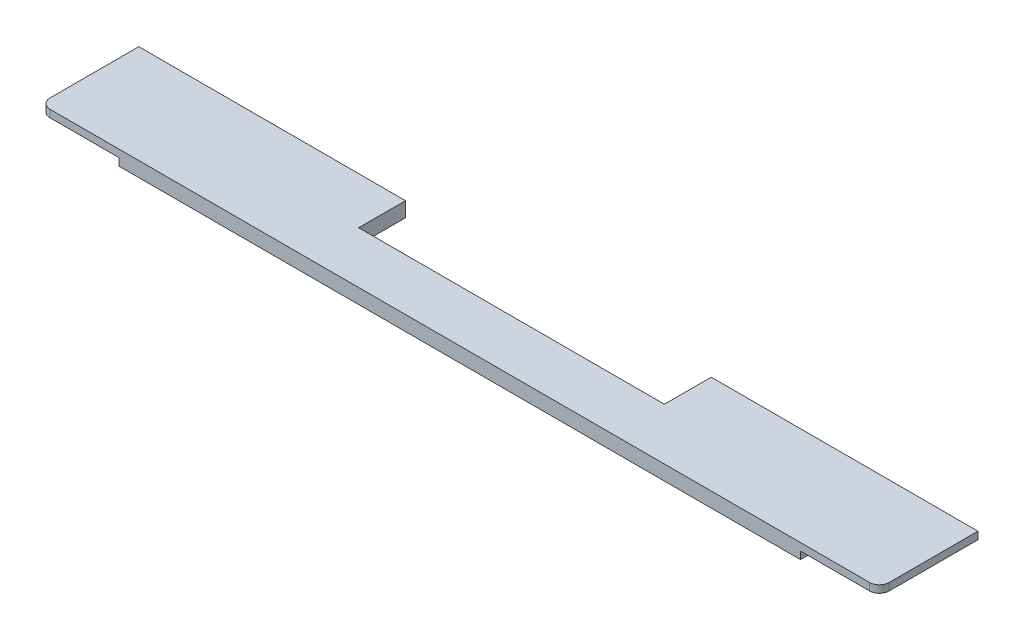
ISO-10303-21;
HEADER;
FILE_DESCRIPTION(('STEP AP214'),'2;1');
FILE_NAME('part.step','',(''),(''),'','','');
FILE_SCHEMA(('AUTOMOTIVE_DESIGN { 1 0 10303 214 1 1 1 1 }'));
ENDSEC;
DATA;
#1=APPLICATION_CONTEXT('core data for automotive mechanical design processes');
#2=APPLICATION_PROTOCOL_DEFINITION('international standard','automotive_design',2000,#1);
#3=PRODUCT_CONTEXT('',#1,'mechanical');
#4=PRODUCT('Part','Part','',(#3));
#5=PRODUCT_RELATED_PRODUCT_CATEGORY('part','',(#4));
#6=PRODUCT_DEFINITION_FORMATION('','',#4);
#7=PRODUCT_DEFINITION_CONTEXT('part definition',#1,'design');
#8=PRODUCT_DEFINITION('design','',#6,#7);
#9=PRODUCT_DEFINITION_SHAPE('','',#8);
#10=(LENGTH_UNIT() NAMED_UNIT(*) SI_UNIT(.MILLI.,.METRE.));
#11=(NAMED_UNIT(*) PLANE_ANGLE_UNIT() SI_UNIT($,.RADIAN.));
#12=(NAMED_UNIT(*) SI_UNIT($,.STERADIAN.) SOLID_ANGLE_UNIT());
#13=UNCERTAINTY_MEASURE_WITH_UNIT(LENGTH_MEASURE(1.E-05),#10,'distance_accuracy_value','');
#14=(GEOMETRIC_REPRESENTATION_CONTEXT(3) GLOBAL_UNCERTAINTY_ASSIGNED_CONTEXT((#13)) GLOBAL_UNIT_ASSIGNED_CONTEXT((#10,
#11,#12)) REPRESENTATION_CONTEXT('',''));
#15=CARTESIAN_POINT('',(0.,0.,0.));
#16=DIRECTION('',(0.,0.,1.));
#17=DIRECTION('',(1.,0.,0.));
#18=AXIS2_PLACEMENT_3D('',#15,#16,#17);
#19=CARTESIAN_POINT('',(0.,3.,-20.));
#20=DIRECTION('',(0.,0.,1.));
#21=DIRECTION('',(1.,0.,0.));
#22=AXIS2_PLACEMENT_3D('',#19,#20,#21);
#23=PLANE('',#22);
#24=DIRECTION('',(-1.,0.,0.));
#25=VECTOR('',#24,1.);
#26=CARTESIAN_POINT('',(0.,3.,-20.));
#27=LINE('',#26,#25);
#28=CARTESIAN_POINT('',(38.1,3.,-20.));
#29=VERTEX_POINT('',#28);
#30=CARTESIAN_POINT('',(-16.,3.,-20.));
#31=VERTEX_POINT('',#30);
#32=EDGE_CURVE('E146',#29,#31,#27,.T.);
#33=ORIENTED_EDGE('',*,*,#32,.F.);
#34=DIRECTION('',(0.,1.,0.));
#35=VECTOR('',#34,1.);
#36=CARTESIAN_POINT('',(38.1,0.,-20.));
#37=LINE('',#36,#35);
#38=CARTESIAN_POINT('',(38.1,0.,-20.));
#39=VERTEX_POINT('',#38);
#40=EDGE_CURVE('E232',#39,#29,#37,.T.);
#41=ORIENTED_EDGE('',*,*,#40,.F.);
#42=DIRECTION('',(-1.,0.,0.));
#43=VECTOR('',#42,1.);
#44=CARTESIAN_POINT('',(0.,0.,-20.));
#45=LINE('',#44,#43);
#46=CARTESIAN_POINT('',(0.,0.,-20.));
#47=VERTEX_POINT('',#46);
#48=EDGE_CURVE('E263',#39,#47,#45,.T.);
#49=ORIENTED_EDGE('',*,*,#48,.T.);
#50=DIRECTION('',(0.,-1.,0.));
#51=VECTOR('',#50,1.);
#52=CARTESIAN_POINT('',(0.,3.,-20.));
#53=LINE('',#52,#51);
#54=CARTESIAN_POINT('',(0.,1.5,-20.));
#55=VERTEX_POINT('',#54);
#56=EDGE_CURVE('E251',#55,#47,#53,.T.);
#57=ORIENTED_EDGE('',*,*,#56,.F.);
#58=DIRECTION('',(-1.,0.,0.));
#59=VECTOR('',#58,1.);
#60=CARTESIAN_POINT('',(0.,1.5,-20.));
#61=LINE('',#60,#59);
#62=CARTESIAN_POINT('',(-16.,1.5,-20.));
#63=VERTEX_POINT('',#62);
#64=EDGE_CURVE('E163',#55,#63,#61,.T.);
#65=ORIENTED_EDGE('',*,*,#64,.T.);
#66=DIRECTION('',(0.,1.,0.));
#67=VECTOR('',#66,1.);
#68=CARTESIAN_POINT('',(-16.,1.5,-20.));
#69=LINE('',#68,#67);
#70=EDGE_CURVE('E161',#63,#31,#69,.T.);
#71=ORIENTED_EDGE('',*,*,#70,.T.);
#72=EDGE_LOOP('',(#33,#41,#49,#57,#65,#71));
#73=FACE_BOUND('',#72,.T.);
#74=ADVANCED_FACE('F43',(#73),#23,.F.);
#75=CARTESIAN_POINT('',(0.,3.,0.));
#76=DIRECTION('',(1.,0.,0.));
#77=DIRECTION('',(0.,0.,-1.));
#78=AXIS2_PLACEMENT_3D('',#75,#76,#77);
#79=PLANE('',#78);
#80=DIRECTION('',(0.,-1.,0.));
#81=VECTOR('',#80,1.);
#82=CARTESIAN_POINT('',(0.,3.,0.));
#83=LINE('',#82,#81);
#84=CARTESIAN_POINT('',(0.,1.5,0.));
#85=VERTEX_POINT('',#84);
#86=CARTESIAN_POINT('',(0.,0.,0.));
#87=VERTEX_POINT('',#86);
#88=EDGE_CURVE('E275',#85,#87,#83,.T.);
#89=ORIENTED_EDGE('',*,*,#88,.F.);
#90=DIRECTION('',(0.,0.,-1.));
#91=VECTOR('',#90,1.);
#92=CARTESIAN_POINT('',(0.,1.5,-20.));
#93=LINE('',#92,#91);
#94=EDGE_CURVE('E176',#85,#55,#93,.T.);
#95=ORIENTED_EDGE('',*,*,#94,.T.);
#96=ORIENTED_EDGE('',*,*,#56,.T.);
#97=DIRECTION('',(0.,0.,1.));
#98=VECTOR('',#97,1.);
#99=CARTESIAN_POINT('',(0.,0.,0.));
#100=LINE('',#99,#98);
#101=EDGE_CURVE('E235',#47,#87,#100,.T.);
#102=ORIENTED_EDGE('',*,*,#101,.T.);
#103=EDGE_LOOP('',(#89,#95,#96,#102));
#104=FACE_BOUND('',#103,.T.);
#105=ADVANCED_FACE('F305',(#104),#79,.F.);
#106=CARTESIAN_POINT('',(0.,3.,0.));
#107=DIRECTION('',(0.,0.,-1.));
#108=DIRECTION('',(-1.,0.,0.));
#109=AXIS2_PLACEMENT_3D('',#106,#107,#108);
#110=PLANE('',#109);
#111=DIRECTION('',(1.,0.,0.));
#112=VECTOR('',#111,1.);
#113=CARTESIAN_POINT('',(0.,3.,0.));
#114=LINE('',#113,#112);
#115=CARTESIAN_POINT('',(-14.,3.,0.));
#116=VERTEX_POINT('',#115);
#117=CARTESIAN_POINT('',(152.2,3.,0.));
#118=VERTEX_POINT('',#117);
#119=EDGE_CURVE('E158',#116,#118,#114,.T.);
#120=ORIENTED_EDGE('',*,*,#119,.F.);
#121=DIRECTION('',(0.,1.,0.));
#122=VECTOR('',#121,1.);
#123=CARTESIAN_POINT('',(-14.,1.5,0.));
#124=LINE('',#123,#122);
#125=CARTESIAN_POINT('',(-14.,1.5,0.));
#126=VERTEX_POINT('',#125);
#127=EDGE_CURVE('E66',#116,#126,#124,.F.);
#128=ORIENTED_EDGE('',*,*,#127,.T.);
#129=DIRECTION('',(1.,0.,0.));
#130=VECTOR('',#129,1.);
#131=CARTESIAN_POINT('',(0.,1.5,0.));
#132=LINE('',#131,#130);
#133=EDGE_CURVE('E168',#126,#85,#132,.T.);
#134=ORIENTED_EDGE('',*,*,#133,.T.);
#135=ORIENTED_EDGE('',*,*,#88,.T.);
#136=DIRECTION('',(1.,0.,0.));
#137=VECTOR('',#136,1.);
#138=CARTESIAN_POINT('',(0.,0.,0.));
#139=LINE('',#138,#137);
#140=CARTESIAN_POINT('',(138.2,0.,0.));
#141=VERTEX_POINT('',#140);
#142=EDGE_CURVE('E255',#87,#141,#139,.T.);
#143=ORIENTED_EDGE('',*,*,#142,.T.);
#144=DIRECTION('',(0.,-1.,0.));
#145=VECTOR('',#144,1.);
#146=CARTESIAN_POINT('',(138.2,3.,0.));
#147=LINE('',#146,#145);
#148=CARTESIAN_POINT('',(138.2,1.5,0.));
#149=VERTEX_POINT('',#148);
#150=EDGE_CURVE('E272',#149,#141,#147,.T.);
#151=ORIENTED_EDGE('',*,*,#150,.F.);
#152=DIRECTION('',(1.,0.,0.));
#153=VECTOR('',#152,1.);
#154=CARTESIAN_POINT('',(138.2,1.5,0.));
#155=LINE('',#154,#153);
#156=CARTESIAN_POINT('',(152.2,1.5,0.));
#157=VERTEX_POINT('',#156);
#158=EDGE_CURVE('E199',#149,#157,#155,.T.);
#159=ORIENTED_EDGE('',*,*,#158,.T.);
#160=DIRECTION('',(0.,1.,0.));
#161=VECTOR('',#160,1.);
#162=CARTESIAN_POINT('',(152.2,3.,0.));
#163=LINE('',#162,#161);
#164=EDGE_CURVE('E286',#157,#118,#163,.T.);
#165=ORIENTED_EDGE('',*,*,#164,.T.);
#166=EDGE_LOOP('',(#120,#128,#134,#135,#143,#151,#159,#165));
#167=FACE_BOUND('',#166,.T.);
#168=ADVANCED_FACE('F312',(#167),#110,.F.);
#169=CARTESIAN_POINT('',(138.2,3.,0.));
#170=DIRECTION('',(-1.,0.,0.));
#171=DIRECTION('',(0.,0.,1.));
#172=AXIS2_PLACEMENT_3D('',#169,#170,#171);
#173=PLANE('',#172);
#174=DIRECTION('',(0.,-1.,0.));
#175=VECTOR('',#174,1.);
#176=CARTESIAN_POINT('',(138.2,3.,-20.));
#177=LINE('',#176,#175);
#178=CARTESIAN_POINT('',(138.2,1.5,-20.));
#179=VERTEX_POINT('',#178);
#180=CARTESIAN_POINT('',(138.2,0.,-20.));
#181=VERTEX_POINT('',#180);
#182=EDGE_CURVE('E269',#179,#181,#177,.T.);
#183=ORIENTED_EDGE('',*,*,#182,.F.);
#184=DIRECTION('',(0.,0.,1.));
#185=VECTOR('',#184,1.);
#186=CARTESIAN_POINT('',(138.2,1.5,-20.));
#187=LINE('',#186,#185);
#188=EDGE_CURVE('E195',#179,#149,#187,.T.);
#189=ORIENTED_EDGE('',*,*,#188,.T.);
#190=ORIENTED_EDGE('',*,*,#150,.T.);
#191=DIRECTION('',(0.,0.,-1.));
#192=VECTOR('',#191,1.);
#193=CARTESIAN_POINT('',(138.2,0.,0.));
#194=LINE('',#193,#192);
#195=EDGE_CURVE('E259',#141,#181,#194,.T.);
#196=ORIENTED_EDGE('',*,*,#195,.T.);
#197=EDGE_LOOP('',(#183,#189,#190,#196));
#198=FACE_BOUND('',#197,.T.);
#199=ADVANCED_FACE('F327',(#198),#173,.F.);
#200=CARTESIAN_POINT('',(100.1,0.,-20.));
#201=VERTEX_POINT('',#200);
#202=EDGE_CURVE('E247',#181,#201,#45,.T.);
#203=ORIENTED_EDGE('',*,*,#202,.T.);
#204=DIRECTION('',(0.,1.,0.));
#205=VECTOR('',#204,1.);
#206=CARTESIAN_POINT('',(100.1,0.,-20.));
#207=LINE('',#206,#205);
#208=CARTESIAN_POINT('',(100.1,3.,-20.));
#209=VERTEX_POINT('',#208);
#210=EDGE_CURVE('E236',#201,#209,#207,.T.);
#211=ORIENTED_EDGE('',*,*,#210,.T.);
#212=CARTESIAN_POINT('',(154.2,3.,-20.));
#213=VERTEX_POINT('',#212);
#214=EDGE_CURVE('E157',#213,#209,#27,.T.);
#215=ORIENTED_EDGE('',*,*,#214,.F.);
#216=DIRECTION('',(0.,1.,0.));
#217=VECTOR('',#216,1.);
#218=CARTESIAN_POINT('',(154.2,1.5,-20.));
#219=LINE('',#218,#217);
#220=CARTESIAN_POINT('',(154.2,1.5,-20.));
#221=VERTEX_POINT('',#220);
#222=EDGE_CURVE('E205',#221,#213,#219,.T.);
#223=ORIENTED_EDGE('',*,*,#222,.F.);
#224=DIRECTION('',(-1.,0.,0.));
#225=VECTOR('',#224,1.);
#226=CARTESIAN_POINT('',(154.2,1.5,-20.));
#227=LINE('',#226,#225);
#228=EDGE_CURVE('E180',#221,#179,#227,.T.);
#229=ORIENTED_EDGE('',*,*,#228,.T.);
#230=ORIENTED_EDGE('',*,*,#182,.T.);
#231=EDGE_LOOP('',(#203,#211,#215,#223,#229,#230));
#232=FACE_BOUND('',#231,.T.);
#233=ADVANCED_FACE('F322',(#232),#23,.F.);
#234=CARTESIAN_POINT('',(0.,3.,0.));
#235=DIRECTION('',(0.,-1.,0.));
#236=DIRECTION('',(0.,0.,-1.));
#237=AXIS2_PLACEMENT_3D('',#234,#235,#236);
#238=PLANE('',#237);
#239=DIRECTION('',(0.,0.,1.));
#240=VECTOR('',#239,1.);
#241=CARTESIAN_POINT('',(-16.,3.,-20.));
#242=LINE('',#241,#240);
#243=CARTESIAN_POINT('',(-16.,3.,-2.));
#244=VERTEX_POINT('',#243);
#245=EDGE_CURVE('E150',#31,#244,#242,.T.);
#246=ORIENTED_EDGE('',*,*,#245,.T.);
#247=CARTESIAN_POINT('',(-14.,3.,-2.));
#248=DIRECTION('',(0.,-1.,0.));
#249=DIRECTION('',(0.,0.,-1.));
#250=AXIS2_PLACEMENT_3D('',#247,#248,#249);
#251=CIRCLE('',#250,2.);
#252=EDGE_CURVE('E283',#244,#116,#251,.F.);
#253=ORIENTED_EDGE('',*,*,#252,.T.);
#254=ORIENTED_EDGE('',*,*,#119,.T.);
#255=CARTESIAN_POINT('',(152.2,3.,-2.));
#256=DIRECTION('',(0.,-1.,0.));
#257=DIRECTION('',(0.,0.,-1.));
#258=AXIS2_PLACEMENT_3D('',#255,#256,#257);
#259=CIRCLE('',#258,2.);
#260=CARTESIAN_POINT('',(154.2,3.,-2.));
#261=VERTEX_POINT('',#260);
#262=EDGE_CURVE('E280',#118,#261,#259,.F.);
#263=ORIENTED_EDGE('',*,*,#262,.T.);
#264=DIRECTION('',(0.,0.,-1.));
#265=VECTOR('',#264,1.);
#266=CARTESIAN_POINT('',(154.2,3.,0.));
#267=LINE('',#266,#265);
#268=EDGE_CURVE('E175',#261,#213,#267,.T.);
#269=ORIENTED_EDGE('',*,*,#268,.T.);
#270=ORIENTED_EDGE('',*,*,#214,.T.);
#271=DIRECTION('',(0.,0.,-1.));
#272=VECTOR('',#271,1.);
#273=CARTESIAN_POINT('',(100.1,3.,-20.));
#274=LINE('',#273,#272);
#275=CARTESIAN_POINT('',(100.1,3.,-10.5));
#276=VERTEX_POINT('',#275);
#277=EDGE_CURVE('E215',#276,#209,#274,.T.);
#278=ORIENTED_EDGE('',*,*,#277,.F.);
#279=DIRECTION('',(1.,0.,0.));
#280=VECTOR('',#279,1.);
#281=CARTESIAN_POINT('',(38.1,3.,-10.5));
#282=LINE('',#281,#280);
#283=CARTESIAN_POINT('',(38.1,3.,-10.5));
#284=VERTEX_POINT('',#283);
#285=EDGE_CURVE('E226',#284,#276,#282,.T.);
#286=ORIENTED_EDGE('',*,*,#285,.F.);
#287=DIRECTION('',(0.,0.,1.));
#288=VECTOR('',#287,1.);
#289=CARTESIAN_POINT('',(38.1,3.,-20.));
#290=LINE('',#289,#288);
#291=EDGE_CURVE('E153',#29,#284,#290,.T.);
#292=ORIENTED_EDGE('',*,*,#291,.F.);
#293=ORIENTED_EDGE('',*,*,#32,.T.);
#294=EDGE_LOOP('',(#246,#253,#254,#263,#269,#270,#278,#286,#292,#293));
#295=FACE_BOUND('',#294,.T.);
#296=ADVANCED_FACE('F148',(#295),#238,.F.);
#297=CARTESIAN_POINT('',(0.,0.,0.));
#298=DIRECTION('',(0.,-1.,0.));
#299=DIRECTION('',(0.,0.,-1.));
#300=AXIS2_PLACEMENT_3D('',#297,#298,#299);
#301=PLANE('',#300);
#302=DIRECTION('',(0.,0.,1.));
#303=VECTOR('',#302,1.);
#304=CARTESIAN_POINT('',(38.1,0.,-20.));
#305=LINE('',#304,#303);
#306=CARTESIAN_POINT('',(38.1,0.,-10.5));
#307=VERTEX_POINT('',#306);
#308=EDGE_CURVE('E210',#39,#307,#305,.T.);
#309=ORIENTED_EDGE('',*,*,#308,.T.);
#310=DIRECTION('',(1.,0.,0.));
#311=VECTOR('',#310,1.);
#312=CARTESIAN_POINT('',(38.1,0.,-10.5));
#313=LINE('',#312,#311);
#314=CARTESIAN_POINT('',(100.1,0.,-10.5));
#315=VERTEX_POINT('',#314);
#316=EDGE_CURVE('E214',#307,#315,#313,.T.);
#317=ORIENTED_EDGE('',*,*,#316,.T.);
#318=DIRECTION('',(0.,0.,-1.));
#319=VECTOR('',#318,1.);
#320=CARTESIAN_POINT('',(100.1,0.,-20.));
#321=LINE('',#320,#319);
#322=EDGE_CURVE('E219',#315,#201,#321,.T.);
#323=ORIENTED_EDGE('',*,*,#322,.T.);
#324=ORIENTED_EDGE('',*,*,#202,.F.);
#325=ORIENTED_EDGE('',*,*,#195,.F.);
#326=ORIENTED_EDGE('',*,*,#142,.F.);
#327=ORIENTED_EDGE('',*,*,#101,.F.);
#328=ORIENTED_EDGE('',*,*,#48,.F.);
#329=EDGE_LOOP('',(#309,#317,#323,#324,#325,#326,#327,#328));
#330=FACE_BOUND('',#329,.T.);
#331=ADVANCED_FACE('F301',(#330),#301,.T.);
#332=CARTESIAN_POINT('',(38.1,0.,-20.));
#333=DIRECTION('',(-1.,0.,0.));
#334=DIRECTION('',(0.,0.,1.));
#335=AXIS2_PLACEMENT_3D('',#332,#333,#334);
#336=PLANE('',#335);
#337=ORIENTED_EDGE('',*,*,#291,.T.);
#338=DIRECTION('',(0.,1.,0.));
#339=VECTOR('',#338,1.);
#340=CARTESIAN_POINT('',(38.1,0.,-10.5));
#341=LINE('',#340,#339);
#342=EDGE_CURVE('E223',#307,#284,#341,.T.);
#343=ORIENTED_EDGE('',*,*,#342,.F.);
#344=ORIENTED_EDGE('',*,*,#308,.F.);
#345=ORIENTED_EDGE('',*,*,#40,.T.);
#346=EDGE_LOOP('',(#337,#343,#344,#345));
#347=FACE_BOUND('',#346,.T.);
#348=ADVANCED_FACE('F337',(#347),#336,.F.);
#349=CARTESIAN_POINT('',(100.1,0.,-20.));
#350=DIRECTION('',(1.,0.,0.));
#351=DIRECTION('',(0.,0.,-1.));
#352=AXIS2_PLACEMENT_3D('',#349,#350,#351);
#353=PLANE('',#352);
#354=ORIENTED_EDGE('',*,*,#277,.T.);
#355=ORIENTED_EDGE('',*,*,#210,.F.);
#356=ORIENTED_EDGE('',*,*,#322,.F.);
#357=DIRECTION('',(0.,1.,0.));
#358=VECTOR('',#357,1.);
#359=CARTESIAN_POINT('',(100.1,0.,-10.5));
#360=LINE('',#359,#358);
#361=EDGE_CURVE('E240',#315,#276,#360,.T.);
#362=ORIENTED_EDGE('',*,*,#361,.T.);
#363=EDGE_LOOP('',(#354,#355,#356,#362));
#364=FACE_BOUND('',#363,.T.);
#365=ADVANCED_FACE('F331',(#364),#353,.F.);
#366=CARTESIAN_POINT('',(38.1,0.,-10.5));
#367=DIRECTION('',(0.,0.,1.));
#368=DIRECTION('',(1.,0.,0.));
#369=AXIS2_PLACEMENT_3D('',#366,#367,#368);
#370=PLANE('',#369);
#371=ORIENTED_EDGE('',*,*,#285,.T.);
#372=ORIENTED_EDGE('',*,*,#361,.F.);
#373=ORIENTED_EDGE('',*,*,#316,.F.);
#374=ORIENTED_EDGE('',*,*,#342,.T.);
#375=EDGE_LOOP('',(#371,#372,#373,#374));
#376=FACE_BOUND('',#375,.T.);
#377=ADVANCED_FACE('F335',(#376),#370,.F.);
#378=CARTESIAN_POINT('',(154.2,1.5,0.));
#379=DIRECTION('',(1.,0.,0.));
#380=DIRECTION('',(0.,0.,-1.));
#381=AXIS2_PLACEMENT_3D('',#378,#379,#380);
#382=PLANE('',#381);
#383=ORIENTED_EDGE('',*,*,#268,.F.);
#384=DIRECTION('',(0.,1.,0.));
#385=VECTOR('',#384,1.);
#386=CARTESIAN_POINT('',(154.2,1.5,-2.));
#387=LINE('',#386,#385);
#388=CARTESIAN_POINT('',(154.2,1.5,-2.));
#389=VERTEX_POINT('',#388);
#390=EDGE_CURVE('E52',#261,#389,#387,.F.);
#391=ORIENTED_EDGE('',*,*,#390,.T.);
#392=DIRECTION('',(0.,0.,-1.));
#393=VECTOR('',#392,1.);
#394=CARTESIAN_POINT('',(154.2,1.5,0.));
#395=LINE('',#394,#393);
#396=EDGE_CURVE('E203',#389,#221,#395,.T.);
#397=ORIENTED_EDGE('',*,*,#396,.T.);
#398=ORIENTED_EDGE('',*,*,#222,.T.);
#399=EDGE_LOOP('',(#383,#391,#397,#398));
#400=FACE_BOUND('',#399,.T.);
#401=ADVANCED_FACE('F318',(#400),#382,.T.);
#402=CARTESIAN_POINT('',(0.,1.5,0.));
#403=DIRECTION('',(0.,1.,0.));
#404=DIRECTION('',(0.,0.,1.));
#405=AXIS2_PLACEMENT_3D('',#402,#403,#404);
#406=PLANE('',#405);
#407=ORIENTED_EDGE('',*,*,#396,.F.);
#408=CARTESIAN_POINT('',(152.2,1.5,-2.));
#409=DIRECTION('',(0.,1.,0.));
#410=DIRECTION('',(0.,0.,1.));
#411=AXIS2_PLACEMENT_3D('',#408,#409,#410);
#412=CIRCLE('',#411,2.);
#413=EDGE_CURVE('E11',#389,#157,#412,.F.);
#414=ORIENTED_EDGE('',*,*,#413,.T.);
#415=ORIENTED_EDGE('',*,*,#158,.F.);
#416=ORIENTED_EDGE('',*,*,#188,.F.);
#417=ORIENTED_EDGE('',*,*,#228,.F.);
#418=EDGE_LOOP('',(#407,#414,#415,#416,#417));
#419=FACE_BOUND('',#418,.T.);
#420=ADVANCED_FACE('F325',(#419),#406,.F.);
#421=CARTESIAN_POINT('',(-16.,1.5,-20.));
#422=DIRECTION('',(-1.,0.,0.));
#423=DIRECTION('',(0.,0.,1.));
#424=AXIS2_PLACEMENT_3D('',#421,#422,#423);
#425=PLANE('',#424);
#426=DIRECTION('',(0.,0.,1.));
#427=VECTOR('',#426,1.);
#428=CARTESIAN_POINT('',(-16.,1.5,-20.));
#429=LINE('',#428,#427);
#430=CARTESIAN_POINT('',(-16.,1.5,-2.));
#431=VERTEX_POINT('',#430);
#432=EDGE_CURVE('E187',#63,#431,#429,.T.);
#433=ORIENTED_EDGE('',*,*,#432,.T.);
#434=DIRECTION('',(0.,1.,0.));
#435=VECTOR('',#434,1.);
#436=CARTESIAN_POINT('',(-16.,3.,-2.));
#437=LINE('',#436,#435);
#438=EDGE_CURVE('E173',#431,#244,#437,.T.);
#439=ORIENTED_EDGE('',*,*,#438,.T.);
#440=ORIENTED_EDGE('',*,*,#245,.F.);
#441=ORIENTED_EDGE('',*,*,#70,.F.);
#442=EDGE_LOOP('',(#433,#439,#440,#441));
#443=FACE_BOUND('',#442,.T.);
#444=ADVANCED_FACE('F171',(#443),#425,.T.);
#445=CARTESIAN_POINT('',(0.,1.5,0.));
#446=DIRECTION('',(0.,-1.,0.));
#447=DIRECTION('',(0.,0.,-1.));
#448=AXIS2_PLACEMENT_3D('',#445,#446,#447);
#449=PLANE('',#448);
#450=ORIENTED_EDGE('',*,*,#133,.F.);
#451=CARTESIAN_POINT('',(-14.,1.5,-2.));
#452=DIRECTION('',(0.,-1.,0.));
#453=DIRECTION('',(0.,0.,-1.));
#454=AXIS2_PLACEMENT_3D('',#451,#452,#453);
#455=CIRCLE('',#454,2.);
#456=EDGE_CURVE('E292',#126,#431,#455,.T.);
#457=ORIENTED_EDGE('',*,*,#456,.T.);
#458=ORIENTED_EDGE('',*,*,#432,.F.);
#459=ORIENTED_EDGE('',*,*,#64,.F.);
#460=ORIENTED_EDGE('',*,*,#94,.F.);
#461=EDGE_LOOP('',(#450,#457,#458,#459,#460));
#462=FACE_BOUND('',#461,.T.);
#463=ADVANCED_FACE('F308',(#462),#449,.T.);
#464=CARTESIAN_POINT('',(-14.,1.5,-2.));
#465=DIRECTION('',(0.,-1.,0.));
#466=DIRECTION('',(0.,0.,-1.));
#467=AXIS2_PLACEMENT_3D('',#464,#465,#466);
#468=CYLINDRICAL_SURFACE('',#467,2.);
#469=ORIENTED_EDGE('',*,*,#456,.F.);
#470=ORIENTED_EDGE('',*,*,#127,.F.);
#471=ORIENTED_EDGE('',*,*,#252,.F.);
#472=ORIENTED_EDGE('',*,*,#438,.F.);
#473=EDGE_LOOP('',(#469,#470,#471,#472));
#474=FACE_BOUND('',#473,.T.);
#475=ADVANCED_FACE('F311',(#474),#468,.T.);
#476=CARTESIAN_POINT('',(152.2,3.,-2.));
#477=DIRECTION('',(0.,-1.,0.));
#478=DIRECTION('',(0.,0.,-1.));
#479=AXIS2_PLACEMENT_3D('',#476,#477,#478);
#480=CYLINDRICAL_SURFACE('',#479,2.);
#481=ORIENTED_EDGE('',*,*,#413,.F.);
#482=ORIENTED_EDGE('',*,*,#390,.F.);
#483=ORIENTED_EDGE('',*,*,#262,.F.);
#484=ORIENTED_EDGE('',*,*,#164,.F.);
#485=EDGE_LOOP('',(#481,#482,#483,#484));
#486=FACE_BOUND('',#485,.T.);
#487=ADVANCED_FACE('F45',(#486),#480,.T.);
#488=CLOSED_SHELL('',(#74,#105,#168,#199,#233,#296,#331,#348,#365,#377,#401,#420,#444,#463,#475,#487));
#489=MANIFOLD_SOLID_BREP('B2',#488);
#490=ADVANCED_BREP_SHAPE_REPRESENTATION('',(#18,#489),#14);
#491=SHAPE_DEFINITION_REPRESENTATION(#9,#490);
ENDSEC;
END-ISO-10303-21;
